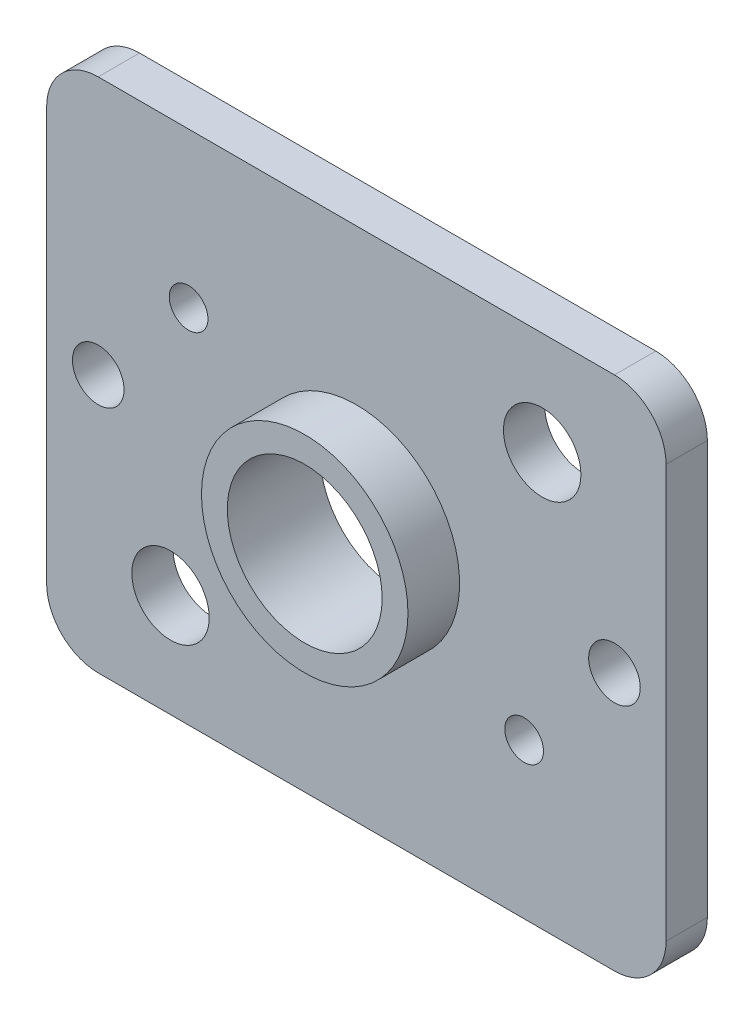
ISO-10303-21;
HEADER;
FILE_DESCRIPTION(('STEP AP214'),'2;1');
FILE_NAME('part.step','',(''),(''),'','','');
FILE_SCHEMA(('AUTOMOTIVE_DESIGN { 1 0 10303 214 1 1 1 1 }'));
ENDSEC;
DATA;
#1=APPLICATION_CONTEXT('core data for automotive mechanical design processes');
#2=APPLICATION_PROTOCOL_DEFINITION('international standard','automotive_design',2000,#1);
#3=PRODUCT_CONTEXT('',#1,'mechanical');
#4=PRODUCT('Part','Part','',(#3));
#5=PRODUCT_RELATED_PRODUCT_CATEGORY('part','',(#4));
#6=PRODUCT_DEFINITION_FORMATION('','',#4);
#7=PRODUCT_DEFINITION_CONTEXT('part definition',#1,'design');
#8=PRODUCT_DEFINITION('design','',#6,#7);
#9=PRODUCT_DEFINITION_SHAPE('','',#8);
#10=(LENGTH_UNIT() NAMED_UNIT(*) SI_UNIT(.MILLI.,.METRE.));
#11=(NAMED_UNIT(*) PLANE_ANGLE_UNIT() SI_UNIT($,.RADIAN.));
#12=(NAMED_UNIT(*) SI_UNIT($,.STERADIAN.) SOLID_ANGLE_UNIT());
#13=UNCERTAINTY_MEASURE_WITH_UNIT(LENGTH_MEASURE(1.E-05),#10,'distance_accuracy_value','');
#14=(GEOMETRIC_REPRESENTATION_CONTEXT(3) GLOBAL_UNCERTAINTY_ASSIGNED_CONTEXT((#13)) GLOBAL_UNIT_ASSIGNED_CONTEXT((#10,
#11,#12)) REPRESENTATION_CONTEXT('',''));
#15=CARTESIAN_POINT('',(0.,0.,0.));
#16=DIRECTION('',(0.,0.,1.));
#17=DIRECTION('',(1.,0.,0.));
#18=AXIS2_PLACEMENT_3D('',#15,#16,#17);
#19=CARTESIAN_POINT('',(0.,0.,0.8));
#20=DIRECTION('',(0.,0.,-1.));
#21=DIRECTION('',(-1.,0.,0.));
#22=AXIS2_PLACEMENT_3D('',#19,#20,#21);
#23=PLANE('',#22);
#24=DIRECTION('',(1.,0.,0.));
#25=VECTOR('',#24,1.);
#26=CARTESIAN_POINT('',(-6.,-5.,0.8));
#27=LINE('',#26,#25);
#28=CARTESIAN_POINT('',(-5.,-5.,0.8));
#29=VERTEX_POINT('',#28);
#30=CARTESIAN_POINT('',(5.,-5.,0.8));
#31=VERTEX_POINT('',#30);
#32=EDGE_CURVE('E138',#29,#31,#27,.T.);
#33=ORIENTED_EDGE('',*,*,#32,.T.);
#34=CARTESIAN_POINT('',(5.,-4.,0.8));
#35=DIRECTION('',(0.,0.,-1.));
#36=DIRECTION('',(-1.,0.,0.));
#37=AXIS2_PLACEMENT_3D('',#34,#35,#36);
#38=CIRCLE('',#37,1.);
#39=CARTESIAN_POINT('',(6.,-4.,0.8));
#40=VERTEX_POINT('',#39);
#41=EDGE_CURVE('E157',#31,#40,#38,.F.);
#42=ORIENTED_EDGE('',*,*,#41,.T.);
#43=DIRECTION('',(0.,1.,0.));
#44=VECTOR('',#43,1.);
#45=CARTESIAN_POINT('',(6.,-5.,0.8));
#46=LINE('',#45,#44);
#47=CARTESIAN_POINT('',(6.,4.,0.8));
#48=VERTEX_POINT('',#47);
#49=EDGE_CURVE('E122',#40,#48,#46,.T.);
#50=ORIENTED_EDGE('',*,*,#49,.T.);
#51=CARTESIAN_POINT('',(5.,4.,0.8));
#52=DIRECTION('',(0.,0.,-1.));
#53=DIRECTION('',(-1.,0.,0.));
#54=AXIS2_PLACEMENT_3D('',#51,#52,#53);
#55=CIRCLE('',#54,1.);
#56=CARTESIAN_POINT('',(5.,5.,0.8));
#57=VERTEX_POINT('',#56);
#58=EDGE_CURVE('E152',#48,#57,#55,.F.);
#59=ORIENTED_EDGE('',*,*,#58,.T.);
#60=DIRECTION('',(-1.,0.,0.));
#61=VECTOR('',#60,1.);
#62=CARTESIAN_POINT('',(-6.,5.,0.8));
#63=LINE('',#62,#61);
#64=CARTESIAN_POINT('',(-5.,5.,0.8));
#65=VERTEX_POINT('',#64);
#66=EDGE_CURVE('E169',#57,#65,#63,.T.);
#67=ORIENTED_EDGE('',*,*,#66,.T.);
#68=CARTESIAN_POINT('',(-5.,4.,0.8));
#69=DIRECTION('',(0.,0.,-1.));
#70=DIRECTION('',(-1.,0.,0.));
#71=AXIS2_PLACEMENT_3D('',#68,#69,#70);
#72=CIRCLE('',#71,1.);
#73=CARTESIAN_POINT('',(-6.,4.,0.8));
#74=VERTEX_POINT('',#73);
#75=EDGE_CURVE('E57',#65,#74,#72,.F.);
#76=ORIENTED_EDGE('',*,*,#75,.T.);
#77=DIRECTION('',(0.,-1.,0.));
#78=VECTOR('',#77,1.);
#79=CARTESIAN_POINT('',(-6.,-5.,0.8));
#80=LINE('',#79,#78);
#81=CARTESIAN_POINT('',(-6.,-4.,0.8));
#82=VERTEX_POINT('',#81);
#83=EDGE_CURVE('E175',#74,#82,#80,.T.);
#84=ORIENTED_EDGE('',*,*,#83,.T.);
#85=CARTESIAN_POINT('',(-5.,-4.,0.8));
#86=DIRECTION('',(0.,0.,-1.));
#87=DIRECTION('',(-1.,0.,0.));
#88=AXIS2_PLACEMENT_3D('',#85,#86,#87);
#89=CIRCLE('',#88,1.);
#90=EDGE_CURVE('E155',#82,#29,#89,.F.);
#91=ORIENTED_EDGE('',*,*,#90,.T.);
#92=EDGE_LOOP('',(#33,#42,#50,#59,#67,#76,#84,#91));
#93=FACE_BOUND('',#92,.T.);
#94=CARTESIAN_POINT('',(-3.6,-3.,0.8));
#95=DIRECTION('',(0.,0.,1.));
#96=DIRECTION('',(1.,0.,0.));
#97=AXIS2_PLACEMENT_3D('',#94,#95,#96);
#98=CIRCLE('',#97,0.75);
#99=CARTESIAN_POINT('',(-2.84999999999999,-3.,0.8));
#100=VERTEX_POINT('',#99);
#101=EDGE_CURVE('E135',#100,#100,#98,.T.);
#102=ORIENTED_EDGE('',*,*,#101,.F.);
#103=EDGE_LOOP('',(#102));
#104=FACE_BOUND('',#103,.T.);
#105=CARTESIAN_POINT('',(3.6,3.,0.8));
#106=DIRECTION('',(0.,0.,1.));
#107=DIRECTION('',(1.,0.,0.));
#108=AXIS2_PLACEMENT_3D('',#105,#106,#107);
#109=CIRCLE('',#108,0.750000000000001);
#110=CARTESIAN_POINT('',(4.35,3.,0.8));
#111=VERTEX_POINT('',#110);
#112=EDGE_CURVE('E193',#111,#111,#109,.T.);
#113=ORIENTED_EDGE('',*,*,#112,.F.);
#114=EDGE_LOOP('',(#113));
#115=FACE_BOUND('',#114,.T.);
#116=CARTESIAN_POINT('',(3.25,-2.,0.8));
#117=DIRECTION('',(0.,0.,1.));
#118=DIRECTION('',(1.,0.,0.));
#119=AXIS2_PLACEMENT_3D('',#116,#117,#118);
#120=CIRCLE('',#119,0.375);
#121=CARTESIAN_POINT('',(3.625,-2.,0.8));
#122=VERTEX_POINT('',#121);
#123=EDGE_CURVE('E194',#122,#122,#120,.T.);
#124=ORIENTED_EDGE('',*,*,#123,.F.);
#125=EDGE_LOOP('',(#124));
#126=FACE_BOUND('',#125,.T.);
#127=CARTESIAN_POINT('',(-3.24999999999999,2.00000000000002,0.8));
#128=DIRECTION('',(0.,0.,1.));
#129=DIRECTION('',(1.,0.,0.));
#130=AXIS2_PLACEMENT_3D('',#127,#128,#129);
#131=CIRCLE('',#130,0.375);
#132=CARTESIAN_POINT('',(-2.87499999999999,2.00000000000002,0.8));
#133=VERTEX_POINT('',#132);
#134=EDGE_CURVE('E205',#133,#133,#131,.T.);
#135=ORIENTED_EDGE('',*,*,#134,.F.);
#136=EDGE_LOOP('',(#135));
#137=FACE_BOUND('',#136,.T.);
#138=CARTESIAN_POINT('',(-5.,0.,0.8));
#139=DIRECTION('',(0.,0.,1.));
#140=DIRECTION('',(1.,0.,0.));
#141=AXIS2_PLACEMENT_3D('',#138,#139,#140);
#142=CIRCLE('',#141,0.500000000000001);
#143=CARTESIAN_POINT('',(-4.5,0.,0.8));
#144=VERTEX_POINT('',#143);
#145=EDGE_CURVE('E214',#144,#144,#142,.T.);
#146=ORIENTED_EDGE('',*,*,#145,.F.);
#147=EDGE_LOOP('',(#146));
#148=FACE_BOUND('',#147,.T.);
#149=CARTESIAN_POINT('',(5.,0.,0.8));
#150=DIRECTION('',(0.,0.,1.));
#151=DIRECTION('',(1.,0.,0.));
#152=AXIS2_PLACEMENT_3D('',#149,#150,#151);
#153=CIRCLE('',#152,0.500000000000001);
#154=CARTESIAN_POINT('',(5.5,0.,0.8));
#155=VERTEX_POINT('',#154);
#156=EDGE_CURVE('E220',#155,#155,#153,.T.);
#157=ORIENTED_EDGE('',*,*,#156,.F.);
#158=EDGE_LOOP('',(#157));
#159=FACE_BOUND('',#158,.T.);
#160=CARTESIAN_POINT('',(0.,0.,0.8));
#161=DIRECTION('',(0.,0.,-1.));
#162=DIRECTION('',(-1.,0.,0.));
#163=AXIS2_PLACEMENT_3D('',#160,#161,#162);
#164=CIRCLE('',#163,2.);
#165=CARTESIAN_POINT('',(-2.,0.,0.8));
#166=VERTEX_POINT('',#165);
#167=EDGE_CURVE('E11',#166,#166,#164,.F.);
#168=ORIENTED_EDGE('',*,*,#167,.F.);
#169=EDGE_LOOP('',(#168));
#170=FACE_BOUND('',#169,.T.);
#171=ADVANCED_FACE('F35',(#93,#104,#115,#126,#137,#148,#159,#170),#23,.F.);
#172=CARTESIAN_POINT('',(6.,-5.,0.8));
#173=DIRECTION('',(-1.,0.,0.));
#174=DIRECTION('',(0.,0.,1.));
#175=AXIS2_PLACEMENT_3D('',#172,#173,#174);
#176=PLANE('',#175);
#177=ORIENTED_EDGE('',*,*,#49,.F.);
#178=DIRECTION('',(0.,0.,-1.));
#179=VECTOR('',#178,1.);
#180=CARTESIAN_POINT('',(6.,-4.,0.8));
#181=LINE('',#180,#179);
#182=CARTESIAN_POINT('',(6.,-4.,0.));
#183=VERTEX_POINT('',#182);
#184=EDGE_CURVE('E106',#40,#183,#181,.T.);
#185=ORIENTED_EDGE('',*,*,#184,.T.);
#186=DIRECTION('',(0.,1.,0.));
#187=VECTOR('',#186,1.);
#188=CARTESIAN_POINT('',(6.,-5.,0.));
#189=LINE('',#188,#187);
#190=CARTESIAN_POINT('',(6.,4.,0.));
#191=VERTEX_POINT('',#190);
#192=EDGE_CURVE('E119',#183,#191,#189,.T.);
#193=ORIENTED_EDGE('',*,*,#192,.T.);
#194=DIRECTION('',(0.,0.,-1.));
#195=VECTOR('',#194,1.);
#196=CARTESIAN_POINT('',(6.,4.,0.8));
#197=LINE('',#196,#195);
#198=EDGE_CURVE('E124',#191,#48,#197,.F.);
#199=ORIENTED_EDGE('',*,*,#198,.T.);
#200=EDGE_LOOP('',(#177,#185,#193,#199));
#201=FACE_BOUND('',#200,.T.);
#202=ADVANCED_FACE('F118',(#201),#176,.F.);
#203=CARTESIAN_POINT('',(-6.,5.,0.8));
#204=DIRECTION('',(0.,-1.,0.));
#205=DIRECTION('',(0.,0.,-1.));
#206=AXIS2_PLACEMENT_3D('',#203,#204,#205);
#207=PLANE('',#206);
#208=DIRECTION('',(-1.,0.,0.));
#209=VECTOR('',#208,1.);
#210=CARTESIAN_POINT('',(-6.,5.,0.));
#211=LINE('',#210,#209);
#212=CARTESIAN_POINT('',(5.,5.,0.));
#213=VERTEX_POINT('',#212);
#214=CARTESIAN_POINT('',(-5.,5.,0.));
#215=VERTEX_POINT('',#214);
#216=EDGE_CURVE('E128',#213,#215,#211,.T.);
#217=ORIENTED_EDGE('',*,*,#216,.T.);
#218=DIRECTION('',(0.,0.,-1.));
#219=VECTOR('',#218,1.);
#220=CARTESIAN_POINT('',(-5.,5.,0.8));
#221=LINE('',#220,#219);
#222=EDGE_CURVE('E43',#215,#65,#221,.F.);
#223=ORIENTED_EDGE('',*,*,#222,.T.);
#224=ORIENTED_EDGE('',*,*,#66,.F.);
#225=DIRECTION('',(0.,0.,-1.));
#226=VECTOR('',#225,1.);
#227=CARTESIAN_POINT('',(5.,5.,0.8));
#228=LINE('',#227,#226);
#229=EDGE_CURVE('E163',#57,#213,#228,.T.);
#230=ORIENTED_EDGE('',*,*,#229,.T.);
#231=EDGE_LOOP('',(#217,#223,#224,#230));
#232=FACE_BOUND('',#231,.T.);
#233=ADVANCED_FACE('F168',(#232),#207,.F.);
#234=CARTESIAN_POINT('',(-6.,-5.,0.8));
#235=DIRECTION('',(1.,0.,0.));
#236=DIRECTION('',(0.,0.,-1.));
#237=AXIS2_PLACEMENT_3D('',#234,#235,#236);
#238=PLANE('',#237);
#239=DIRECTION('',(0.,-1.,0.));
#240=VECTOR('',#239,1.);
#241=CARTESIAN_POINT('',(-6.,-5.,0.));
#242=LINE('',#241,#240);
#243=CARTESIAN_POINT('',(-6.,4.,0.));
#244=VERTEX_POINT('',#243);
#245=CARTESIAN_POINT('',(-6.,-4.,0.));
#246=VERTEX_POINT('',#245);
#247=EDGE_CURVE('E132',#244,#246,#242,.T.);
#248=ORIENTED_EDGE('',*,*,#247,.T.);
#249=DIRECTION('',(0.,0.,-1.));
#250=VECTOR('',#249,1.);
#251=CARTESIAN_POINT('',(-6.,-4.,0.8));
#252=LINE('',#251,#250);
#253=EDGE_CURVE('E50',#246,#82,#252,.F.);
#254=ORIENTED_EDGE('',*,*,#253,.T.);
#255=ORIENTED_EDGE('',*,*,#83,.F.);
#256=DIRECTION('',(0.,0.,-1.));
#257=VECTOR('',#256,1.);
#258=CARTESIAN_POINT('',(-6.,4.,0.8));
#259=LINE('',#258,#257);
#260=EDGE_CURVE('E159',#74,#244,#259,.T.);
#261=ORIENTED_EDGE('',*,*,#260,.T.);
#262=EDGE_LOOP('',(#248,#254,#255,#261));
#263=FACE_BOUND('',#262,.T.);
#264=ADVANCED_FACE('F180',(#263),#238,.F.);
#265=CARTESIAN_POINT('',(-6.,-5.,0.8));
#266=DIRECTION('',(0.,1.,0.));
#267=DIRECTION('',(0.,0.,1.));
#268=AXIS2_PLACEMENT_3D('',#265,#266,#267);
#269=PLANE('',#268);
#270=DIRECTION('',(1.,0.,0.));
#271=VECTOR('',#270,1.);
#272=CARTESIAN_POINT('',(-6.,-5.,0.));
#273=LINE('',#272,#271);
#274=CARTESIAN_POINT('',(-5.,-5.,0.));
#275=VERTEX_POINT('',#274);
#276=CARTESIAN_POINT('',(5.,-5.,0.));
#277=VERTEX_POINT('',#276);
#278=EDGE_CURVE('E142',#275,#277,#273,.T.);
#279=ORIENTED_EDGE('',*,*,#278,.T.);
#280=DIRECTION('',(0.,0.,-1.));
#281=VECTOR('',#280,1.);
#282=CARTESIAN_POINT('',(5.,-5.,0.8));
#283=LINE('',#282,#281);
#284=EDGE_CURVE('E107',#277,#31,#283,.F.);
#285=ORIENTED_EDGE('',*,*,#284,.T.);
#286=ORIENTED_EDGE('',*,*,#32,.F.);
#287=DIRECTION('',(0.,0.,-1.));
#288=VECTOR('',#287,1.);
#289=CARTESIAN_POINT('',(-5.,-5.,0.8));
#290=LINE('',#289,#288);
#291=EDGE_CURVE('E112',#29,#275,#290,.T.);
#292=ORIENTED_EDGE('',*,*,#291,.T.);
#293=EDGE_LOOP('',(#279,#285,#286,#292));
#294=FACE_BOUND('',#293,.T.);
#295=ADVANCED_FACE('F187',(#294),#269,.F.);
#296=CARTESIAN_POINT('',(0.,0.,0.));
#297=DIRECTION('',(0.,0.,-1.));
#298=DIRECTION('',(-1.,0.,0.));
#299=AXIS2_PLACEMENT_3D('',#296,#297,#298);
#300=PLANE('',#299);
#301=CARTESIAN_POINT('',(5.,0.,0.));
#302=DIRECTION('',(0.,0.,1.));
#303=DIRECTION('',(1.,0.,0.));
#304=AXIS2_PLACEMENT_3D('',#301,#302,#303);
#305=CIRCLE('',#304,0.500000000000001);
#306=CARTESIAN_POINT('',(5.5,0.,0.));
#307=VERTEX_POINT('',#306);
#308=EDGE_CURVE('E217',#307,#307,#305,.T.);
#309=ORIENTED_EDGE('',*,*,#308,.T.);
#310=EDGE_LOOP('',(#309));
#311=FACE_BOUND('',#310,.T.);
#312=CARTESIAN_POINT('',(-5.,0.,0.));
#313=DIRECTION('',(0.,0.,1.));
#314=DIRECTION('',(1.,0.,0.));
#315=AXIS2_PLACEMENT_3D('',#312,#313,#314);
#316=CIRCLE('',#315,0.500000000000001);
#317=CARTESIAN_POINT('',(-4.5,0.,0.));
#318=VERTEX_POINT('',#317);
#319=EDGE_CURVE('E206',#318,#318,#316,.T.);
#320=ORIENTED_EDGE('',*,*,#319,.T.);
#321=EDGE_LOOP('',(#320));
#322=FACE_BOUND('',#321,.T.);
#323=CARTESIAN_POINT('',(-3.24999999999999,2.00000000000002,0.));
#324=DIRECTION('',(0.,0.,-1.));
#325=DIRECTION('',(-1.,0.,0.));
#326=AXIS2_PLACEMENT_3D('',#323,#324,#325);
#327=CIRCLE('',#326,0.375);
#328=CARTESIAN_POINT('',(-3.62499999999999,2.00000000000002,0.));
#329=VERTEX_POINT('',#328);
#330=EDGE_CURVE('E202',#329,#329,#327,.F.);
#331=ORIENTED_EDGE('',*,*,#330,.T.);
#332=EDGE_LOOP('',(#331));
#333=FACE_BOUND('',#332,.T.);
#334=CARTESIAN_POINT('',(3.25,-2.,0.));
#335=DIRECTION('',(0.,0.,-1.));
#336=DIRECTION('',(-1.,0.,0.));
#337=AXIS2_PLACEMENT_3D('',#334,#335,#336);
#338=CIRCLE('',#337,0.375);
#339=CARTESIAN_POINT('',(2.875,-2.,0.));
#340=VERTEX_POINT('',#339);
#341=EDGE_CURVE('E209',#340,#340,#338,.F.);
#342=ORIENTED_EDGE('',*,*,#341,.T.);
#343=EDGE_LOOP('',(#342));
#344=FACE_BOUND('',#343,.T.);
#345=CARTESIAN_POINT('',(3.6,3.,0.));
#346=DIRECTION('',(0.,0.,-1.));
#347=DIRECTION('',(-1.,0.,0.));
#348=AXIS2_PLACEMENT_3D('',#345,#346,#347);
#349=CIRCLE('',#348,0.750000000000001);
#350=CARTESIAN_POINT('',(4.35,3.,0.));
#351=VERTEX_POINT('',#350);
#352=EDGE_CURVE('E190',#351,#351,#349,.F.);
#353=ORIENTED_EDGE('',*,*,#352,.T.);
#354=EDGE_LOOP('',(#353));
#355=FACE_BOUND('',#354,.T.);
#356=CARTESIAN_POINT('',(-3.6,-3.,0.));
#357=DIRECTION('',(0.,0.,-1.));
#358=DIRECTION('',(-1.,0.,0.));
#359=AXIS2_PLACEMENT_3D('',#356,#357,#358);
#360=CIRCLE('',#359,0.75);
#361=CARTESIAN_POINT('',(-2.84999999999999,-3.,0.));
#362=VERTEX_POINT('',#361);
#363=EDGE_CURVE('E197',#362,#362,#360,.F.);
#364=ORIENTED_EDGE('',*,*,#363,.T.);
#365=EDGE_LOOP('',(#364));
#366=FACE_BOUND('',#365,.T.);
#367=CARTESIAN_POINT('',(0.,0.,0.));
#368=DIRECTION('',(0.,0.,-1.));
#369=DIRECTION('',(-1.,0.,0.));
#370=AXIS2_PLACEMENT_3D('',#367,#368,#369);
#371=CIRCLE('',#370,1.5);
#372=CARTESIAN_POINT('',(1.5,0.,0.));
#373=VERTEX_POINT('',#372);
#374=EDGE_CURVE('E129',#373,#373,#371,.F.);
#375=ORIENTED_EDGE('',*,*,#374,.T.);
#376=EDGE_LOOP('',(#375));
#377=FACE_BOUND('',#376,.T.);
#378=ORIENTED_EDGE('',*,*,#192,.F.);
#379=CARTESIAN_POINT('',(5.,-4.,0.));
#380=DIRECTION('',(0.,0.,-1.));
#381=DIRECTION('',(-1.,0.,0.));
#382=AXIS2_PLACEMENT_3D('',#379,#380,#381);
#383=CIRCLE('',#382,1.);
#384=EDGE_CURVE('E102',#183,#277,#383,.T.);
#385=ORIENTED_EDGE('',*,*,#384,.T.);
#386=ORIENTED_EDGE('',*,*,#278,.F.);
#387=CARTESIAN_POINT('',(-5.,-4.,0.));
#388=DIRECTION('',(0.,0.,-1.));
#389=DIRECTION('',(-1.,0.,0.));
#390=AXIS2_PLACEMENT_3D('',#387,#388,#389);
#391=CIRCLE('',#390,1.);
#392=EDGE_CURVE('E113',#275,#246,#391,.T.);
#393=ORIENTED_EDGE('',*,*,#392,.T.);
#394=ORIENTED_EDGE('',*,*,#247,.F.);
#395=CARTESIAN_POINT('',(-5.,4.,0.));
#396=DIRECTION('',(0.,0.,-1.));
#397=DIRECTION('',(-1.,0.,0.));
#398=AXIS2_PLACEMENT_3D('',#395,#396,#397);
#399=CIRCLE('',#398,1.);
#400=EDGE_CURVE('E146',#244,#215,#399,.T.);
#401=ORIENTED_EDGE('',*,*,#400,.T.);
#402=ORIENTED_EDGE('',*,*,#216,.F.);
#403=CARTESIAN_POINT('',(5.,4.,0.));
#404=DIRECTION('',(0.,0.,-1.));
#405=DIRECTION('',(-1.,0.,0.));
#406=AXIS2_PLACEMENT_3D('',#403,#404,#405);
#407=CIRCLE('',#406,1.);
#408=EDGE_CURVE('E123',#213,#191,#407,.T.);
#409=ORIENTED_EDGE('',*,*,#408,.T.);
#410=EDGE_LOOP('',(#378,#385,#386,#393,#394,#401,#402,#409));
#411=FACE_BOUND('',#410,.T.);
#412=ADVANCED_FACE('F126',(#311,#322,#333,#344,#355,#366,#377,#411),#300,.T.);
#413=CARTESIAN_POINT('',(0.,0.,-0.00100000000000002));
#414=DIRECTION('',(0.,0.,1.));
#415=DIRECTION('',(1.,0.,0.));
#416=AXIS2_PLACEMENT_3D('',#413,#414,#415);
#417=CYLINDRICAL_SURFACE('',#416,1.5);
#418=CARTESIAN_POINT('',(0.,0.,1.8));
#419=DIRECTION('',(0.,0.,1.));
#420=DIRECTION('',(1.,0.,0.));
#421=AXIS2_PLACEMENT_3D('',#418,#419,#420);
#422=CIRCLE('',#421,1.5);
#423=CARTESIAN_POINT('',(1.5,0.,1.8));
#424=VERTEX_POINT('',#423);
#425=EDGE_CURVE('E228',#424,#424,#422,.T.);
#426=CARTESIAN_POINT('',(1.5,0.,0.));
#427=CARTESIAN_POINT('',(1.5,0.,0.01875));
#428=CARTESIAN_POINT('',(1.5,0.,0.0375));
#429=CARTESIAN_POINT('',(1.5,0.,0.075));
#430=CARTESIAN_POINT('',(1.5,0.,0.09375));
#431=CARTESIAN_POINT('',(1.5,0.,0.13125));
#432=CARTESIAN_POINT('',(1.5,0.,0.15));
#433=CARTESIAN_POINT('',(1.5,0.,0.1875));
#434=CARTESIAN_POINT('',(1.5,0.,0.20625));
#435=CARTESIAN_POINT('',(1.5,0.,0.24375));
#436=CARTESIAN_POINT('',(1.5,0.,0.2625));
#437=CARTESIAN_POINT('',(1.5,0.,0.3));
#438=CARTESIAN_POINT('',(1.5,0.,0.31875));
#439=CARTESIAN_POINT('',(1.5,0.,0.35625));
#440=CARTESIAN_POINT('',(1.5,0.,0.375));
#441=CARTESIAN_POINT('',(1.5,0.,0.4125));
#442=CARTESIAN_POINT('',(1.5,0.,0.43125));
#443=CARTESIAN_POINT('',(1.5,0.,0.46875));
#444=CARTESIAN_POINT('',(1.5,0.,0.4875));
#445=CARTESIAN_POINT('',(1.5,0.,0.525));
#446=CARTESIAN_POINT('',(1.5,0.,0.54375));
#447=CARTESIAN_POINT('',(1.5,0.,0.58125));
#448=CARTESIAN_POINT('',(1.5,0.,0.6));
#449=CARTESIAN_POINT('',(1.5,0.,0.6375));
#450=CARTESIAN_POINT('',(1.5,0.,0.65625));
#451=CARTESIAN_POINT('',(1.5,0.,0.69375));
#452=CARTESIAN_POINT('',(1.5,0.,0.7125));
#453=CARTESIAN_POINT('',(1.5,0.,0.75));
#454=CARTESIAN_POINT('',(1.5,0.,0.76875));
#455=CARTESIAN_POINT('',(1.5,0.,0.80625));
#456=CARTESIAN_POINT('',(1.5,0.,0.825));
#457=CARTESIAN_POINT('',(1.5,0.,0.8625));
#458=CARTESIAN_POINT('',(1.5,0.,0.88125));
#459=CARTESIAN_POINT('',(1.5,0.,0.91875));
#460=CARTESIAN_POINT('',(1.5,0.,0.9375));
#461=CARTESIAN_POINT('',(1.5,0.,0.975));
#462=CARTESIAN_POINT('',(1.5,0.,0.99375));
#463=CARTESIAN_POINT('',(1.5,0.,1.03125));
#464=CARTESIAN_POINT('',(1.5,0.,1.05));
#465=CARTESIAN_POINT('',(1.5,0.,1.0875));
#466=CARTESIAN_POINT('',(1.5,0.,1.10625));
#467=CARTESIAN_POINT('',(1.5,0.,1.14375));
#468=CARTESIAN_POINT('',(1.5,0.,1.1625));
#469=CARTESIAN_POINT('',(1.5,0.,1.2));
#470=CARTESIAN_POINT('',(1.5,0.,1.21875));
#471=CARTESIAN_POINT('',(1.5,0.,1.25625));
#472=CARTESIAN_POINT('',(1.5,0.,1.275));
#473=CARTESIAN_POINT('',(1.5,0.,1.3125));
#474=CARTESIAN_POINT('',(1.5,0.,1.33125));
#475=CARTESIAN_POINT('',(1.5,0.,1.36875));
#476=CARTESIAN_POINT('',(1.5,0.,1.3875));
#477=CARTESIAN_POINT('',(1.5,0.,1.425));
#478=CARTESIAN_POINT('',(1.5,0.,1.44375));
#479=CARTESIAN_POINT('',(1.5,0.,1.48125));
#480=CARTESIAN_POINT('',(1.5,0.,1.5));
#481=CARTESIAN_POINT('',(1.5,0.,1.5375));
#482=CARTESIAN_POINT('',(1.5,0.,1.55625));
#483=CARTESIAN_POINT('',(1.5,0.,1.59375));
#484=CARTESIAN_POINT('',(1.5,0.,1.6125));
#485=CARTESIAN_POINT('',(1.5,0.,1.65));
#486=CARTESIAN_POINT('',(1.5,0.,1.66875));
#487=CARTESIAN_POINT('',(1.5,0.,1.70625));
#488=CARTESIAN_POINT('',(1.5,0.,1.725));
#489=CARTESIAN_POINT('',(1.5,0.,1.7625));
#490=CARTESIAN_POINT('',(1.5,0.,1.78125));
#491=CARTESIAN_POINT('',(1.5,0.,1.8));
#492=B_SPLINE_CURVE_WITH_KNOTS('',3,(#426,#427,#428,#429,#430,#431,#432,#433,#434,#435,#436,
#437,#438,#439,#440,#441,#442,#443,#444,#445,#446,#447,#448,#449,#450,#451,#452,#453,#454,#455,
#456,#457,#458,#459,#460,#461,#462,#463,#464,#465,#466,#467,#468,#469,#470,#471,#472,#473,#474,
#475,#476,#477,#478,#479,#480,#481,#482,#483,#484,#485,#486,#487,#488,#489,#490,#491),
.UNSPECIFIED.,.F.,.F.,(4,2,2,2,2,2,2,2,2,2,2,2,2,2,2,2,2,2,2,2,2,2,2,2,2,2,2,2,2,2,2,2,4),(0.,
0.05625,0.1125,0.16875,0.225,0.28125,0.3375,0.39375,0.45,0.50625,0.5625,0.61875,0.675,0.73125,
0.7875,0.84375,0.9,0.95625,1.0125,1.06875,1.125,1.18125,1.2375,1.29375,1.35,1.40625,1.4625,
1.51875,1.575,1.63125,1.6875,1.74375,1.8),.UNSPECIFIED.);
#493=EDGE_CURVE('BSEAM232',#373,#424,#492,.T.);
#494=ORIENTED_EDGE('',*,*,#374,.F.);
#495=ORIENTED_EDGE('',*,*,#425,.T.);
#496=ORIENTED_EDGE('',*,*,#493,.T.);
#497=ORIENTED_EDGE('',*,*,#493,.F.);
#498=EDGE_LOOP('',(#494,#496,#495,#497));
#499=FACE_BOUND('',#498,.T.);
#500=ADVANCED_FACE('F232',(#499),#417,.F.);
#501=CARTESIAN_POINT('',(-3.6,-3.,-0.00100000000000002));
#502=DIRECTION('',(0.,0.,1.));
#503=DIRECTION('',(1.,0.,0.));
#504=AXIS2_PLACEMENT_3D('',#501,#502,#503);
#505=CYLINDRICAL_SURFACE('',#504,0.75);
#506=CARTESIAN_POINT('',(-2.84999999999999,-3.,0.));
#507=CARTESIAN_POINT('',(-2.84999999999999,-3.,0.00833333333333333));
#508=CARTESIAN_POINT('',(-2.84999999999999,-3.,0.0166666666666667));
#509=CARTESIAN_POINT('',(-2.84999999999999,-3.,0.0333333333333333));
#510=CARTESIAN_POINT('',(-2.84999999999999,-3.,0.0416666666666667));
#511=CARTESIAN_POINT('',(-2.84999999999999,-3.,0.0583333333333333));
#512=CARTESIAN_POINT('',(-2.84999999999999,-3.,0.0666666666666667));
#513=CARTESIAN_POINT('',(-2.84999999999999,-3.,0.0833333333333333));
#514=CARTESIAN_POINT('',(-2.84999999999999,-3.,0.0916666666666667));
#515=CARTESIAN_POINT('',(-2.84999999999999,-3.,0.108333333333333));
#516=CARTESIAN_POINT('',(-2.84999999999999,-3.,0.116666666666667));
#517=CARTESIAN_POINT('',(-2.84999999999999,-3.,0.133333333333333));
#518=CARTESIAN_POINT('',(-2.84999999999999,-3.,0.141666666666667));
#519=CARTESIAN_POINT('',(-2.84999999999999,-3.,0.158333333333333));
#520=CARTESIAN_POINT('',(-2.84999999999999,-3.,0.166666666666667));
#521=CARTESIAN_POINT('',(-2.84999999999999,-3.,0.183333333333333));
#522=CARTESIAN_POINT('',(-2.84999999999999,-3.,0.191666666666667));
#523=CARTESIAN_POINT('',(-2.84999999999999,-3.,0.208333333333333));
#524=CARTESIAN_POINT('',(-2.84999999999999,-3.,0.216666666666667));
#525=CARTESIAN_POINT('',(-2.84999999999999,-3.,0.233333333333333));
#526=CARTESIAN_POINT('',(-2.84999999999999,-3.,0.241666666666667));
#527=CARTESIAN_POINT('',(-2.84999999999999,-3.,0.258333333333333));
#528=CARTESIAN_POINT('',(-2.84999999999999,-3.,0.266666666666667));
#529=CARTESIAN_POINT('',(-2.84999999999999,-3.,0.283333333333333));
#530=CARTESIAN_POINT('',(-2.84999999999999,-3.,0.291666666666667));
#531=CARTESIAN_POINT('',(-2.84999999999999,-3.,0.308333333333333));
#532=CARTESIAN_POINT('',(-2.84999999999999,-3.,0.316666666666667));
#533=CARTESIAN_POINT('',(-2.84999999999999,-3.,0.333333333333333));
#534=CARTESIAN_POINT('',(-2.84999999999999,-3.,0.341666666666667));
#535=CARTESIAN_POINT('',(-2.84999999999999,-3.,0.358333333333333));
#536=CARTESIAN_POINT('',(-2.84999999999999,-3.,0.366666666666667));
#537=CARTESIAN_POINT('',(-2.84999999999999,-3.,0.383333333333333));
#538=CARTESIAN_POINT('',(-2.84999999999999,-3.,0.391666666666667));
#539=CARTESIAN_POINT('',(-2.84999999999999,-3.,0.408333333333333));
#540=CARTESIAN_POINT('',(-2.84999999999999,-3.,0.416666666666667));
#541=CARTESIAN_POINT('',(-2.84999999999999,-3.,0.433333333333333));
#542=CARTESIAN_POINT('',(-2.84999999999999,-3.,0.441666666666667));
#543=CARTESIAN_POINT('',(-2.84999999999999,-3.,0.458333333333333));
#544=CARTESIAN_POINT('',(-2.84999999999999,-3.,0.466666666666667));
#545=CARTESIAN_POINT('',(-2.84999999999999,-3.,0.483333333333333));
#546=CARTESIAN_POINT('',(-2.84999999999999,-3.,0.491666666666667));
#547=CARTESIAN_POINT('',(-2.84999999999999,-3.,0.508333333333333));
#548=CARTESIAN_POINT('',(-2.84999999999999,-3.,0.516666666666667));
#549=CARTESIAN_POINT('',(-2.84999999999999,-3.,0.533333333333333));
#550=CARTESIAN_POINT('',(-2.84999999999999,-3.,0.541666666666667));
#551=CARTESIAN_POINT('',(-2.84999999999999,-3.,0.558333333333333));
#552=CARTESIAN_POINT('',(-2.84999999999999,-3.,0.566666666666667));
#553=CARTESIAN_POINT('',(-2.84999999999999,-3.,0.583333333333333));
#554=CARTESIAN_POINT('',(-2.84999999999999,-3.,0.591666666666667));
#555=CARTESIAN_POINT('',(-2.84999999999999,-3.,0.608333333333333));
#556=CARTESIAN_POINT('',(-2.84999999999999,-3.,0.616666666666667));
#557=CARTESIAN_POINT('',(-2.84999999999999,-3.,0.633333333333333));
#558=CARTESIAN_POINT('',(-2.84999999999999,-3.,0.641666666666667));
#559=CARTESIAN_POINT('',(-2.84999999999999,-3.,0.658333333333333));
#560=CARTESIAN_POINT('',(-2.84999999999999,-3.,0.666666666666667));
#561=CARTESIAN_POINT('',(-2.84999999999999,-3.,0.683333333333333));
#562=CARTESIAN_POINT('',(-2.84999999999999,-3.,0.691666666666667));
#563=CARTESIAN_POINT('',(-2.84999999999999,-3.,0.708333333333333));
#564=CARTESIAN_POINT('',(-2.84999999999999,-3.,0.716666666666667));
#565=CARTESIAN_POINT('',(-2.84999999999999,-3.,0.733333333333333));
#566=CARTESIAN_POINT('',(-2.84999999999999,-3.,0.741666666666667));
#567=CARTESIAN_POINT('',(-2.84999999999999,-3.,0.758333333333333));
#568=CARTESIAN_POINT('',(-2.84999999999999,-3.,0.766666666666667));
#569=CARTESIAN_POINT('',(-2.84999999999999,-3.,0.783333333333333));
#570=CARTESIAN_POINT('',(-2.84999999999999,-3.,0.791666666666667));
#571=CARTESIAN_POINT('',(-2.84999999999999,-3.,0.8));
#572=B_SPLINE_CURVE_WITH_KNOTS('',3,(#506,#507,#508,#509,#510,#511,#512,#513,#514,#515,#516,
#517,#518,#519,#520,#521,#522,#523,#524,#525,#526,#527,#528,#529,#530,#531,#532,#533,#534,#535,
#536,#537,#538,#539,#540,#541,#542,#543,#544,#545,#546,#547,#548,#549,#550,#551,#552,#553,#554,
#555,#556,#557,#558,#559,#560,#561,#562,#563,#564,#565,#566,#567,#568,#569,#570,#571),
.UNSPECIFIED.,.F.,.F.,(4,2,2,2,2,2,2,2,2,2,2,2,2,2,2,2,2,2,2,2,2,2,2,2,2,2,2,2,2,2,2,2,4),(0.,
0.025,0.05,0.075,0.1,0.125,0.15,0.175,0.2,0.225,0.25,0.275,0.3,0.325,0.35,0.375,0.4,0.425,0.45,
0.475,0.5,0.525,0.55,0.575,0.6,0.625,0.65,0.675,0.7,0.725,0.75,0.775,0.8),.UNSPECIFIED.);
#573=EDGE_CURVE('BSEAM294',#362,#100,#572,.T.);
#574=ORIENTED_EDGE('',*,*,#363,.F.);
#575=ORIENTED_EDGE('',*,*,#101,.T.);
#576=ORIENTED_EDGE('',*,*,#573,.T.);
#577=ORIENTED_EDGE('',*,*,#573,.F.);
#578=EDGE_LOOP('',(#574,#576,#575,#577));
#579=FACE_BOUND('',#578,.T.);
#580=ADVANCED_FACE('F294',(#579),#505,.F.);
#581=CARTESIAN_POINT('',(3.6,3.,-0.00100000000000002));
#582=DIRECTION('',(0.,0.,1.));
#583=DIRECTION('',(1.,0.,0.));
#584=AXIS2_PLACEMENT_3D('',#581,#582,#583);
#585=CYLINDRICAL_SURFACE('',#584,0.750000000000001);
#586=CARTESIAN_POINT('',(4.35,3.,0.));
#587=CARTESIAN_POINT('',(4.35,3.,0.00833333333333333));
#588=CARTESIAN_POINT('',(4.35,3.,0.0166666666666667));
#589=CARTESIAN_POINT('',(4.35,3.,0.0333333333333333));
#590=CARTESIAN_POINT('',(4.35,3.,0.0416666666666667));
#591=CARTESIAN_POINT('',(4.35,3.,0.0583333333333333));
#592=CARTESIAN_POINT('',(4.35,3.,0.0666666666666667));
#593=CARTESIAN_POINT('',(4.35,3.,0.0833333333333333));
#594=CARTESIAN_POINT('',(4.35,3.,0.0916666666666667));
#595=CARTESIAN_POINT('',(4.35,3.,0.108333333333333));
#596=CARTESIAN_POINT('',(4.35,3.,0.116666666666667));
#597=CARTESIAN_POINT('',(4.35,3.,0.133333333333333));
#598=CARTESIAN_POINT('',(4.35,3.,0.141666666666667));
#599=CARTESIAN_POINT('',(4.35,3.,0.158333333333333));
#600=CARTESIAN_POINT('',(4.35,3.,0.166666666666667));
#601=CARTESIAN_POINT('',(4.35,3.,0.183333333333333));
#602=CARTESIAN_POINT('',(4.35,3.,0.191666666666667));
#603=CARTESIAN_POINT('',(4.35,3.,0.208333333333333));
#604=CARTESIAN_POINT('',(4.35,3.,0.216666666666667));
#605=CARTESIAN_POINT('',(4.35,3.,0.233333333333333));
#606=CARTESIAN_POINT('',(4.35,3.,0.241666666666667));
#607=CARTESIAN_POINT('',(4.35,3.,0.258333333333333));
#608=CARTESIAN_POINT('',(4.35,3.,0.266666666666667));
#609=CARTESIAN_POINT('',(4.35,3.,0.283333333333333));
#610=CARTESIAN_POINT('',(4.35,3.,0.291666666666667));
#611=CARTESIAN_POINT('',(4.35,3.,0.308333333333333));
#612=CARTESIAN_POINT('',(4.35,3.,0.316666666666667));
#613=CARTESIAN_POINT('',(4.35,3.,0.333333333333333));
#614=CARTESIAN_POINT('',(4.35,3.,0.341666666666667));
#615=CARTESIAN_POINT('',(4.35,3.,0.358333333333333));
#616=CARTESIAN_POINT('',(4.35,3.,0.366666666666667));
#617=CARTESIAN_POINT('',(4.35,3.,0.383333333333333));
#618=CARTESIAN_POINT('',(4.35,3.,0.391666666666667));
#619=CARTESIAN_POINT('',(4.35,3.,0.408333333333333));
#620=CARTESIAN_POINT('',(4.35,3.,0.416666666666667));
#621=CARTESIAN_POINT('',(4.35,3.,0.433333333333333));
#622=CARTESIAN_POINT('',(4.35,3.,0.441666666666667));
#623=CARTESIAN_POINT('',(4.35,3.,0.458333333333333));
#624=CARTESIAN_POINT('',(4.35,3.,0.466666666666667));
#625=CARTESIAN_POINT('',(4.35,3.,0.483333333333333));
#626=CARTESIAN_POINT('',(4.35,3.,0.491666666666667));
#627=CARTESIAN_POINT('',(4.35,3.,0.508333333333333));
#628=CARTESIAN_POINT('',(4.35,3.,0.516666666666667));
#629=CARTESIAN_POINT('',(4.35,3.,0.533333333333333));
#630=CARTESIAN_POINT('',(4.35,3.,0.541666666666667));
#631=CARTESIAN_POINT('',(4.35,3.,0.558333333333333));
#632=CARTESIAN_POINT('',(4.35,3.,0.566666666666667));
#633=CARTESIAN_POINT('',(4.35,3.,0.583333333333333));
#634=CARTESIAN_POINT('',(4.35,3.,0.591666666666667));
#635=CARTESIAN_POINT('',(4.35,3.,0.608333333333333));
#636=CARTESIAN_POINT('',(4.35,3.,0.616666666666667));
#637=CARTESIAN_POINT('',(4.35,3.,0.633333333333333));
#638=CARTESIAN_POINT('',(4.35,3.,0.641666666666667));
#639=CARTESIAN_POINT('',(4.35,3.,0.658333333333333));
#640=CARTESIAN_POINT('',(4.35,3.,0.666666666666667));
#641=CARTESIAN_POINT('',(4.35,3.,0.683333333333333));
#642=CARTESIAN_POINT('',(4.35,3.,0.691666666666667));
#643=CARTESIAN_POINT('',(4.35,3.,0.708333333333333));
#644=CARTESIAN_POINT('',(4.35,3.,0.716666666666667));
#645=CARTESIAN_POINT('',(4.35,3.,0.733333333333333));
#646=CARTESIAN_POINT('',(4.35,3.,0.741666666666667));
#647=CARTESIAN_POINT('',(4.35,3.,0.758333333333333));
#648=CARTESIAN_POINT('',(4.35,3.,0.766666666666667));
#649=CARTESIAN_POINT('',(4.35,3.,0.783333333333333));
#650=CARTESIAN_POINT('',(4.35,3.,0.791666666666667));
#651=CARTESIAN_POINT('',(4.35,3.,0.8));
#652=B_SPLINE_CURVE_WITH_KNOTS('',3,(#586,#587,#588,#589,#590,#591,#592,#593,#594,#595,#596,
#597,#598,#599,#600,#601,#602,#603,#604,#605,#606,#607,#608,#609,#610,#611,#612,#613,#614,#615,
#616,#617,#618,#619,#620,#621,#622,#623,#624,#625,#626,#627,#628,#629,#630,#631,#632,#633,#634,
#635,#636,#637,#638,#639,#640,#641,#642,#643,#644,#645,#646,#647,#648,#649,#650,#651),
.UNSPECIFIED.,.F.,.F.,(4,2,2,2,2,2,2,2,2,2,2,2,2,2,2,2,2,2,2,2,2,2,2,2,2,2,2,2,2,2,2,2,4),(0.,
0.025,0.05,0.075,0.1,0.125,0.15,0.175,0.2,0.225,0.25,0.275,0.3,0.325,0.35,0.375,0.4,0.425,0.45,
0.475,0.5,0.525,0.55,0.575,0.6,0.625,0.65,0.675,0.7,0.725,0.75,0.775,0.8),.UNSPECIFIED.);
#653=EDGE_CURVE('BSEAM289',#351,#111,#652,.T.);
#654=ORIENTED_EDGE('',*,*,#352,.F.);
#655=ORIENTED_EDGE('',*,*,#112,.T.);
#656=ORIENTED_EDGE('',*,*,#653,.T.);
#657=ORIENTED_EDGE('',*,*,#653,.F.);
#658=EDGE_LOOP('',(#654,#656,#655,#657));
#659=FACE_BOUND('',#658,.T.);
#660=ADVANCED_FACE('F289',(#659),#585,.F.);
#661=CARTESIAN_POINT('',(3.25,-2.,-0.00100000000000002));
#662=DIRECTION('',(0.,0.,1.));
#663=DIRECTION('',(1.,0.,0.));
#664=AXIS2_PLACEMENT_3D('',#661,#662,#663);
#665=CYLINDRICAL_SURFACE('',#664,0.375);
#666=ORIENTED_EDGE('',*,*,#341,.F.);
#667=EDGE_LOOP('',(#666));
#668=FACE_BOUND('',#667,.T.);
#669=ORIENTED_EDGE('',*,*,#123,.T.);
#670=EDGE_LOOP('',(#669));
#671=FACE_BOUND('',#670,.T.);
#672=ADVANCED_FACE('F286',(#668,#671),#665,.F.);
#673=CARTESIAN_POINT('',(-3.24999999999999,2.00000000000002,-0.00100000000000002));
#674=DIRECTION('',(0.,0.,1.));
#675=DIRECTION('',(1.,0.,0.));
#676=AXIS2_PLACEMENT_3D('',#673,#674,#675);
#677=CYLINDRICAL_SURFACE('',#676,0.375);
#678=ORIENTED_EDGE('',*,*,#330,.F.);
#679=EDGE_LOOP('',(#678));
#680=FACE_BOUND('',#679,.T.);
#681=ORIENTED_EDGE('',*,*,#134,.T.);
#682=EDGE_LOOP('',(#681));
#683=FACE_BOUND('',#682,.T.);
#684=ADVANCED_FACE('F269',(#680,#683),#677,.F.);
#685=CARTESIAN_POINT('',(5.,-4.,0.8));
#686=DIRECTION('',(0.,0.,-1.));
#687=DIRECTION('',(-1.,0.,0.));
#688=AXIS2_PLACEMENT_3D('',#685,#686,#687);
#689=CYLINDRICAL_SURFACE('',#688,1.);
#690=ORIENTED_EDGE('',*,*,#41,.F.);
#691=ORIENTED_EDGE('',*,*,#284,.F.);
#692=ORIENTED_EDGE('',*,*,#384,.F.);
#693=ORIENTED_EDGE('',*,*,#184,.F.);
#694=EDGE_LOOP('',(#690,#691,#692,#693));
#695=FACE_BOUND('',#694,.T.);
#696=ADVANCED_FACE('F105',(#695),#689,.T.);
#697=CARTESIAN_POINT('',(-5.,-4.,0.8));
#698=DIRECTION('',(0.,0.,-1.));
#699=DIRECTION('',(-1.,0.,0.));
#700=AXIS2_PLACEMENT_3D('',#697,#698,#699);
#701=CYLINDRICAL_SURFACE('',#700,1.);
#702=ORIENTED_EDGE('',*,*,#90,.F.);
#703=ORIENTED_EDGE('',*,*,#253,.F.);
#704=ORIENTED_EDGE('',*,*,#392,.F.);
#705=ORIENTED_EDGE('',*,*,#291,.F.);
#706=EDGE_LOOP('',(#702,#703,#704,#705));
#707=FACE_BOUND('',#706,.T.);
#708=ADVANCED_FACE('F184',(#707),#701,.T.);
#709=CARTESIAN_POINT('',(-5.,4.,0.8));
#710=DIRECTION('',(0.,0.,-1.));
#711=DIRECTION('',(-1.,0.,0.));
#712=AXIS2_PLACEMENT_3D('',#709,#710,#711);
#713=CYLINDRICAL_SURFACE('',#712,1.);
#714=ORIENTED_EDGE('',*,*,#75,.F.);
#715=ORIENTED_EDGE('',*,*,#222,.F.);
#716=ORIENTED_EDGE('',*,*,#400,.F.);
#717=ORIENTED_EDGE('',*,*,#260,.F.);
#718=EDGE_LOOP('',(#714,#715,#716,#717));
#719=FACE_BOUND('',#718,.T.);
#720=ADVANCED_FACE('F178',(#719),#713,.T.);
#721=CARTESIAN_POINT('',(5.,4.,0.8));
#722=DIRECTION('',(0.,0.,-1.));
#723=DIRECTION('',(-1.,0.,0.));
#724=AXIS2_PLACEMENT_3D('',#721,#722,#723);
#725=CYLINDRICAL_SURFACE('',#724,1.);
#726=ORIENTED_EDGE('',*,*,#58,.F.);
#727=ORIENTED_EDGE('',*,*,#198,.F.);
#728=ORIENTED_EDGE('',*,*,#408,.F.);
#729=ORIENTED_EDGE('',*,*,#229,.F.);
#730=EDGE_LOOP('',(#726,#727,#728,#729));
#731=FACE_BOUND('',#730,.T.);
#732=ADVANCED_FACE('F37',(#731),#725,.T.);
#733=CARTESIAN_POINT('',(-5.,0.,0.));
#734=DIRECTION('',(0.,0.,1.));
#735=DIRECTION('',(1.,0.,0.));
#736=AXIS2_PLACEMENT_3D('',#733,#734,#735);
#737=CYLINDRICAL_SURFACE('',#736,0.500000000000001);
#738=ORIENTED_EDGE('',*,*,#319,.F.);
#739=EDGE_LOOP('',(#738));
#740=FACE_BOUND('',#739,.T.);
#741=ORIENTED_EDGE('',*,*,#145,.T.);
#742=EDGE_LOOP('',(#741));
#743=FACE_BOUND('',#742,.T.);
#744=ADVANCED_FACE('F246',(#740,#743),#737,.F.);
#745=CARTESIAN_POINT('',(5.,0.,0.));
#746=DIRECTION('',(0.,0.,1.));
#747=DIRECTION('',(1.,0.,0.));
#748=AXIS2_PLACEMENT_3D('',#745,#746,#747);
#749=CYLINDRICAL_SURFACE('',#748,0.500000000000001);
#750=ORIENTED_EDGE('',*,*,#308,.F.);
#751=EDGE_LOOP('',(#750));
#752=FACE_BOUND('',#751,.T.);
#753=ORIENTED_EDGE('',*,*,#156,.T.);
#754=EDGE_LOOP('',(#753));
#755=FACE_BOUND('',#754,.T.);
#756=ADVANCED_FACE('F237',(#752,#755),#749,.F.);
#757=CARTESIAN_POINT('',(0.,0.,1.8));
#758=DIRECTION('',(0.,0.,1.));
#759=DIRECTION('',(1.,0.,0.));
#760=AXIS2_PLACEMENT_3D('',#757,#758,#759);
#761=PLANE('',#760);
#762=CARTESIAN_POINT('',(0.,0.,1.8));
#763=DIRECTION('',(0.,0.,1.));
#764=DIRECTION('',(1.,0.,0.));
#765=AXIS2_PLACEMENT_3D('',#762,#763,#764);
#766=CIRCLE('',#765,2.);
#767=CARTESIAN_POINT('',(2.,0.,1.8));
#768=VERTEX_POINT('',#767);
#769=EDGE_CURVE('E223',#768,#768,#766,.T.);
#770=ORIENTED_EDGE('',*,*,#769,.T.);
#771=EDGE_LOOP('',(#770));
#772=FACE_BOUND('',#771,.T.);
#773=ORIENTED_EDGE('',*,*,#425,.F.);
#774=EDGE_LOOP('',(#773));
#775=FACE_BOUND('',#774,.T.);
#776=ADVANCED_FACE('F234',(#772,#775),#761,.T.);
#777=CARTESIAN_POINT('',(0.,0.,1.8));
#778=DIRECTION('',(0.,0.,-1.));
#779=DIRECTION('',(-1.,0.,0.));
#780=AXIS2_PLACEMENT_3D('',#777,#778,#779);
#781=CYLINDRICAL_SURFACE('',#780,2.);
#782=ORIENTED_EDGE('',*,*,#769,.F.);
#783=EDGE_LOOP('',(#782));
#784=FACE_BOUND('',#783,.T.);
#785=ORIENTED_EDGE('',*,*,#167,.T.);
#786=EDGE_LOOP('',(#785));
#787=FACE_BOUND('',#786,.T.);
#788=ADVANCED_FACE('F236',(#784,#787),#781,.T.);
#789=CLOSED_SHELL('',(#171,#202,#233,#264,#295,#412,#500,#580,#660,#672,#684,#696,#708,#720,
#732,#744,#756,#776,#788));
#790=MANIFOLD_SOLID_BREP('B2',#789);
#791=ADVANCED_BREP_SHAPE_REPRESENTATION('',(#18,#790),#14);
#792=SHAPE_DEFINITION_REPRESENTATION(#9,#791);
ENDSEC;
END-ISO-10303-21;
